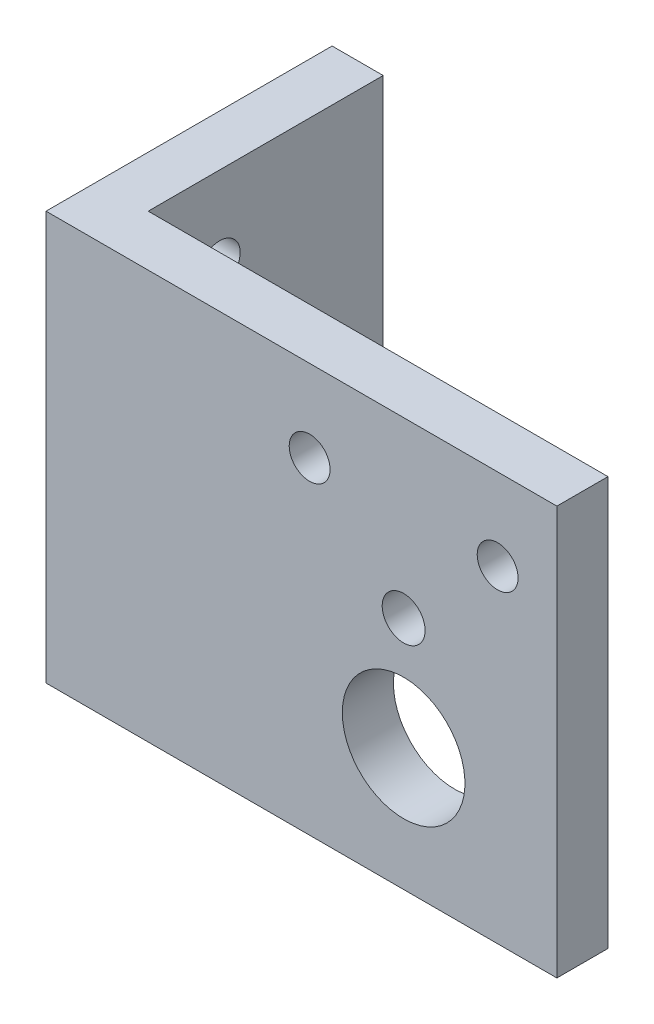
ISO-10303-21;
HEADER;
FILE_DESCRIPTION(('STEP AP214'),'2;1');
FILE_NAME('part.step','',(''),(''),'','','');
FILE_SCHEMA(('AUTOMOTIVE_DESIGN { 1 0 10303 214 1 1 1 1 }'));
ENDSEC;
DATA;
#1=APPLICATION_CONTEXT('core data for automotive mechanical design processes');
#2=APPLICATION_PROTOCOL_DEFINITION('international standard','automotive_design',2000,#1);
#3=PRODUCT_CONTEXT('',#1,'mechanical');
#4=PRODUCT('Part','Part','',(#3));
#5=PRODUCT_RELATED_PRODUCT_CATEGORY('part','',(#4));
#6=PRODUCT_DEFINITION_FORMATION('','',#4);
#7=PRODUCT_DEFINITION_CONTEXT('part definition',#1,'design');
#8=PRODUCT_DEFINITION('design','',#6,#7);
#9=PRODUCT_DEFINITION_SHAPE('','',#8);
#10=(LENGTH_UNIT() NAMED_UNIT(*) SI_UNIT(.MILLI.,.METRE.));
#11=(NAMED_UNIT(*) PLANE_ANGLE_UNIT() SI_UNIT($,.RADIAN.));
#12=(NAMED_UNIT(*) SI_UNIT($,.STERADIAN.) SOLID_ANGLE_UNIT());
#13=UNCERTAINTY_MEASURE_WITH_UNIT(LENGTH_MEASURE(1.E-05),#10,'distance_accuracy_value','');
#14=(GEOMETRIC_REPRESENTATION_CONTEXT(3) GLOBAL_UNCERTAINTY_ASSIGNED_CONTEXT((#13)) GLOBAL_UNIT_ASSIGNED_CONTEXT((#10,
#11,#12)) REPRESENTATION_CONTEXT('',''));
#15=CARTESIAN_POINT('',(0.,0.,0.));
#16=DIRECTION('',(0.,0.,1.));
#17=DIRECTION('',(1.,0.,0.));
#18=AXIS2_PLACEMENT_3D('',#15,#16,#17);
#19=CARTESIAN_POINT('',(5.,20.,-20.));
#20=DIRECTION('',(-0.707106781186548,0.,0.707106781186548));
#21=DIRECTION('',(0.707106781186547,0.,0.707106781186547));
#22=AXIS2_PLACEMENT_3D('',#19,#20,#21);
#23=PLANE('',#22);
#24=DIRECTION('',(0.,1.,0.));
#25=VECTOR('',#24,1.);
#26=CARTESIAN_POINT('',(5.,40.,-20.));
#27=LINE('',#26,#25);
#28=CARTESIAN_POINT('',(5.,16.75,-20.));
#29=VERTEX_POINT('',#28);
#30=CARTESIAN_POINT('',(5.,15.,-20.));
#31=VERTEX_POINT('',#30);
#32=EDGE_CURVE('E120',#29,#31,#27,.F.);
#33=ORIENTED_EDGE('',*,*,#32,.F.);
#34=CARTESIAN_POINT('',(5.,20.,-20.));
#35=DIRECTION('',(-0.707106781186548,0.,0.707106781186548));
#36=DIRECTION('',(-0.707106781186548,0.,-0.707106781186548));
#37=AXIS2_PLACEMENT_3D('',#34,#35,#36);
#38=ELLIPSE('',#37,4.59619407771255,3.25);
#39=CARTESIAN_POINT('',(5.,23.25,-20.));
#40=VERTEX_POINT('',#39);
#41=EDGE_CURVE('E11',#29,#40,#38,.T.);
#42=ORIENTED_EDGE('',*,*,#41,.T.);
#43=CARTESIAN_POINT('',(5.,25.,-20.));
#44=VERTEX_POINT('',#43);
#45=EDGE_CURVE('E117',#44,#40,#27,.F.);
#46=ORIENTED_EDGE('',*,*,#45,.F.);
#47=DIRECTION('',(0.707106781186547,0.,0.707106781186547));
#48=VECTOR('',#47,1.);
#49=CARTESIAN_POINT('',(5.,25.,-20.));
#50=LINE('',#49,#48);
#51=CARTESIAN_POINT('',(20.,25.,-5.));
#52=VERTEX_POINT('',#51);
#53=EDGE_CURVE('E208',#44,#52,#50,.T.);
#54=ORIENTED_EDGE('',*,*,#53,.T.);
#55=DIRECTION('',(0.,-1.,0.));
#56=VECTOR('',#55,1.);
#57=CARTESIAN_POINT('',(20.,40.,-5.));
#58=LINE('',#57,#56);
#59=CARTESIAN_POINT('',(20.,15.,-5.));
#60=VERTEX_POINT('',#59);
#61=EDGE_CURVE('E199',#60,#52,#58,.F.);
#62=ORIENTED_EDGE('',*,*,#61,.F.);
#63=DIRECTION('',(0.707106781186547,0.,0.707106781186547));
#64=VECTOR('',#63,1.);
#65=CARTESIAN_POINT('',(5.,15.,-20.));
#66=LINE('',#65,#64);
#67=EDGE_CURVE('E209',#31,#60,#66,.T.);
#68=ORIENTED_EDGE('',*,*,#67,.F.);
#69=EDGE_LOOP('',(#33,#42,#46,#54,#62,#68));
#70=FACE_BOUND('',#69,.T.);
#71=ADVANCED_FACE('F35',(#70),#23,.F.);
#72=CARTESIAN_POINT('',(0.,40.,-35.));
#73=DIRECTION('',(1.,0.,0.));
#74=DIRECTION('',(0.,0.,-1.));
#75=AXIS2_PLACEMENT_3D('',#72,#73,#74);
#76=PLANE('',#75);
#77=CARTESIAN_POINT('',(0.,20.,-20.));
#78=DIRECTION('',(1.,0.,0.));
#79=DIRECTION('',(0.,0.,-1.));
#80=AXIS2_PLACEMENT_3D('',#77,#78,#79);
#81=CIRCLE('',#80,2.);
#82=CARTESIAN_POINT('',(0.,20.,-22.));
#83=VERTEX_POINT('',#82);
#84=EDGE_CURVE('E112',#83,#83,#81,.T.);
#85=ORIENTED_EDGE('',*,*,#84,.T.);
#86=EDGE_LOOP('',(#85));
#87=FACE_BOUND('',#86,.T.);
#88=DIRECTION('',(0.,0.,1.));
#89=VECTOR('',#88,1.);
#90=CARTESIAN_POINT('',(0.,40.,-35.));
#91=LINE('',#90,#89);
#92=CARTESIAN_POINT('',(0.,40.,-28.));
#93=VERTEX_POINT('',#92);
#94=CARTESIAN_POINT('',(0.,40.,0.));
#95=VERTEX_POINT('',#94);
#96=EDGE_CURVE('E145',#93,#95,#91,.T.);
#97=ORIENTED_EDGE('',*,*,#96,.F.);
#98=DIRECTION('',(0.,-1.,0.));
#99=VECTOR('',#98,1.);
#100=CARTESIAN_POINT('',(0.,40.,-28.));
#101=LINE('',#100,#99);
#102=CARTESIAN_POINT('',(0.,0.,-28.));
#103=VERTEX_POINT('',#102);
#104=EDGE_CURVE('E216',#93,#103,#101,.T.);
#105=ORIENTED_EDGE('',*,*,#104,.T.);
#106=DIRECTION('',(0.,0.,1.));
#107=VECTOR('',#106,1.);
#108=CARTESIAN_POINT('',(0.,0.,-35.));
#109=LINE('',#108,#107);
#110=CARTESIAN_POINT('',(0.,0.,0.));
#111=VERTEX_POINT('',#110);
#112=EDGE_CURVE('E153',#103,#111,#109,.T.);
#113=ORIENTED_EDGE('',*,*,#112,.T.);
#114=DIRECTION('',(0.,-1.,0.));
#115=VECTOR('',#114,1.);
#116=CARTESIAN_POINT('',(0.,40.,0.));
#117=LINE('',#116,#115);
#118=EDGE_CURVE('E130',#95,#111,#117,.T.);
#119=ORIENTED_EDGE('',*,*,#118,.F.);
#120=EDGE_LOOP('',(#97,#105,#113,#119));
#121=FACE_BOUND('',#120,.T.);
#122=CARTESIAN_POINT('',(0.,32.,-12.));
#123=DIRECTION('',(1.,0.,0.));
#124=DIRECTION('',(0.,0.,-1.));
#125=AXIS2_PLACEMENT_3D('',#122,#123,#124);
#126=CIRCLE('',#125,2.);
#127=CARTESIAN_POINT('',(0.,32.,-14.));
#128=VERTEX_POINT('',#127);
#129=EDGE_CURVE('E170',#128,#128,#126,.T.);
#130=ORIENTED_EDGE('',*,*,#129,.T.);
#131=EDGE_LOOP('',(#130));
#132=FACE_BOUND('',#131,.T.);
#133=CARTESIAN_POINT('',(0.,8.,-12.));
#134=DIRECTION('',(1.,0.,0.));
#135=DIRECTION('',(0.,0.,-1.));
#136=AXIS2_PLACEMENT_3D('',#133,#134,#135);
#137=CIRCLE('',#136,2.);
#138=CARTESIAN_POINT('',(0.,8.,-14.));
#139=VERTEX_POINT('',#138);
#140=EDGE_CURVE('E192',#139,#139,#137,.T.);
#141=ORIENTED_EDGE('',*,*,#140,.T.);
#142=EDGE_LOOP('',(#141));
#143=FACE_BOUND('',#142,.T.);
#144=ADVANCED_FACE('F37',(#87,#121,#132,#143),#76,.F.);
#145=CARTESIAN_POINT('',(0.,40.,0.));
#146=DIRECTION('',(0.,0.,-1.));
#147=DIRECTION('',(-1.,0.,0.));
#148=AXIS2_PLACEMENT_3D('',#145,#146,#147);
#149=PLANE('',#148);
#150=CARTESIAN_POINT('',(35.,12.,0.));
#151=DIRECTION('',(0.,0.,-1.));
#152=DIRECTION('',(-1.,0.,0.));
#153=AXIS2_PLACEMENT_3D('',#150,#151,#152);
#154=CIRCLE('',#153,5.99999999999999);
#155=CARTESIAN_POINT('',(29.,12.,0.));
#156=VERTEX_POINT('',#155);
#157=EDGE_CURVE('E155',#156,#156,#154,.T.);
#158=ORIENTED_EDGE('',*,*,#157,.T.);
#159=EDGE_LOOP('',(#158));
#160=FACE_BOUND('',#159,.T.);
#161=CARTESIAN_POINT('',(35.,23.,0.));
#162=DIRECTION('',(0.,0.,-1.));
#163=DIRECTION('',(-1.,0.,0.));
#164=AXIS2_PLACEMENT_3D('',#161,#162,#163);
#165=CIRCLE('',#164,2.1);
#166=CARTESIAN_POINT('',(32.9,23.,0.));
#167=VERTEX_POINT('',#166);
#168=EDGE_CURVE('E182',#167,#167,#165,.T.);
#169=ORIENTED_EDGE('',*,*,#168,.T.);
#170=EDGE_LOOP('',(#169));
#171=FACE_BOUND('',#170,.T.);
#172=CARTESIAN_POINT('',(44.2,32.,0.));
#173=DIRECTION('',(0.,0.,-1.));
#174=DIRECTION('',(-1.,0.,0.));
#175=AXIS2_PLACEMENT_3D('',#172,#173,#174);
#176=CIRCLE('',#175,2.);
#177=CARTESIAN_POINT('',(42.2,32.,0.));
#178=VERTEX_POINT('',#177);
#179=EDGE_CURVE('E176',#178,#178,#176,.T.);
#180=ORIENTED_EDGE('',*,*,#179,.T.);
#181=EDGE_LOOP('',(#180));
#182=FACE_BOUND('',#181,.T.);
#183=CARTESIAN_POINT('',(25.8,32.,0.));
#184=DIRECTION('',(0.,0.,-1.));
#185=DIRECTION('',(-1.,0.,0.));
#186=AXIS2_PLACEMENT_3D('',#183,#184,#185);
#187=CIRCLE('',#186,2.);
#188=CARTESIAN_POINT('',(23.8,32.,0.));
#189=VERTEX_POINT('',#188);
#190=EDGE_CURVE('E169',#189,#189,#187,.T.);
#191=ORIENTED_EDGE('',*,*,#190,.T.);
#192=EDGE_LOOP('',(#191));
#193=FACE_BOUND('',#192,.T.);
#194=ORIENTED_EDGE('',*,*,#118,.T.);
#195=DIRECTION('',(1.,0.,0.));
#196=VECTOR('',#195,1.);
#197=CARTESIAN_POINT('',(0.,0.,0.));
#198=LINE('',#197,#196);
#199=CARTESIAN_POINT('',(50.,0.,0.));
#200=VERTEX_POINT('',#199);
#201=EDGE_CURVE('E151',#111,#200,#198,.T.);
#202=ORIENTED_EDGE('',*,*,#201,.T.);
#203=DIRECTION('',(0.,-1.,0.));
#204=VECTOR('',#203,1.);
#205=CARTESIAN_POINT('',(50.,40.,0.));
#206=LINE('',#205,#204);
#207=CARTESIAN_POINT('',(50.,40.,0.));
#208=VERTEX_POINT('',#207);
#209=EDGE_CURVE('E133',#208,#200,#206,.T.);
#210=ORIENTED_EDGE('',*,*,#209,.F.);
#211=DIRECTION('',(1.,0.,0.));
#212=VECTOR('',#211,1.);
#213=CARTESIAN_POINT('',(0.,40.,0.));
#214=LINE('',#213,#212);
#215=EDGE_CURVE('E163',#95,#208,#214,.T.);
#216=ORIENTED_EDGE('',*,*,#215,.F.);
#217=EDGE_LOOP('',(#194,#202,#210,#216));
#218=FACE_BOUND('',#217,.T.);
#219=ADVANCED_FACE('F255',(#160,#171,#182,#193,#218),#149,.F.);
#220=CARTESIAN_POINT('',(50.,40.,0.));
#221=DIRECTION('',(-1.,0.,0.));
#222=DIRECTION('',(0.,0.,1.));
#223=AXIS2_PLACEMENT_3D('',#220,#221,#222);
#224=PLANE('',#223);
#225=DIRECTION('',(0.,0.,-1.));
#226=VECTOR('',#225,1.);
#227=CARTESIAN_POINT('',(50.,0.,0.));
#228=LINE('',#227,#226);
#229=CARTESIAN_POINT('',(50.,0.,-5.));
#230=VERTEX_POINT('',#229);
#231=EDGE_CURVE('E149',#200,#230,#228,.T.);
#232=ORIENTED_EDGE('',*,*,#231,.T.);
#233=DIRECTION('',(0.,-1.,0.));
#234=VECTOR('',#233,1.);
#235=CARTESIAN_POINT('',(50.,40.,-5.));
#236=LINE('',#235,#234);
#237=CARTESIAN_POINT('',(50.,40.,-5.));
#238=VERTEX_POINT('',#237);
#239=EDGE_CURVE('E136',#238,#230,#236,.T.);
#240=ORIENTED_EDGE('',*,*,#239,.F.);
#241=DIRECTION('',(0.,0.,-1.));
#242=VECTOR('',#241,1.);
#243=CARTESIAN_POINT('',(50.,40.,0.));
#244=LINE('',#243,#242);
#245=EDGE_CURVE('E161',#208,#238,#244,.T.);
#246=ORIENTED_EDGE('',*,*,#245,.F.);
#247=ORIENTED_EDGE('',*,*,#209,.T.);
#248=EDGE_LOOP('',(#232,#240,#246,#247));
#249=FACE_BOUND('',#248,.T.);
#250=ADVANCED_FACE('F246',(#249),#224,.F.);
#251=CARTESIAN_POINT('',(50.,40.,-5.));
#252=DIRECTION('',(0.,0.,1.));
#253=DIRECTION('',(1.,0.,0.));
#254=AXIS2_PLACEMENT_3D('',#251,#252,#253);
#255=PLANE('',#254);
#256=CARTESIAN_POINT('',(35.,12.,-5.));
#257=DIRECTION('',(0.,0.,-1.));
#258=DIRECTION('',(-1.,0.,0.));
#259=AXIS2_PLACEMENT_3D('',#256,#257,#258);
#260=CIRCLE('',#259,5.99999999999999);
#261=CARTESIAN_POINT('',(29.,12.,-5.));
#262=VERTEX_POINT('',#261);
#263=EDGE_CURVE('E185',#262,#262,#260,.T.);
#264=ORIENTED_EDGE('',*,*,#263,.F.);
#265=EDGE_LOOP('',(#264));
#266=FACE_BOUND('',#265,.T.);
#267=CARTESIAN_POINT('',(35.,23.,-5.));
#268=DIRECTION('',(0.,0.,-1.));
#269=DIRECTION('',(-1.,0.,0.));
#270=AXIS2_PLACEMENT_3D('',#267,#268,#269);
#271=CIRCLE('',#270,2.1);
#272=CARTESIAN_POINT('',(32.9,23.,-5.));
#273=VERTEX_POINT('',#272);
#274=EDGE_CURVE('E179',#273,#273,#271,.T.);
#275=ORIENTED_EDGE('',*,*,#274,.F.);
#276=EDGE_LOOP('',(#275));
#277=FACE_BOUND('',#276,.T.);
#278=CARTESIAN_POINT('',(44.2,32.,-5.));
#279=DIRECTION('',(0.,0.,-1.));
#280=DIRECTION('',(-1.,0.,0.));
#281=AXIS2_PLACEMENT_3D('',#278,#279,#280);
#282=CIRCLE('',#281,2.);
#283=CARTESIAN_POINT('',(42.2,32.,-5.));
#284=VERTEX_POINT('',#283);
#285=EDGE_CURVE('E173',#284,#284,#282,.T.);
#286=ORIENTED_EDGE('',*,*,#285,.F.);
#287=EDGE_LOOP('',(#286));
#288=FACE_BOUND('',#287,.T.);
#289=CARTESIAN_POINT('',(25.8,32.,-5.));
#290=DIRECTION('',(0.,0.,-1.));
#291=DIRECTION('',(-1.,0.,0.));
#292=AXIS2_PLACEMENT_3D('',#289,#290,#291);
#293=CIRCLE('',#292,2.);
#294=CARTESIAN_POINT('',(23.8,32.,-5.));
#295=VERTEX_POINT('',#294);
#296=EDGE_CURVE('E166',#295,#295,#293,.T.);
#297=ORIENTED_EDGE('',*,*,#296,.F.);
#298=EDGE_LOOP('',(#297));
#299=FACE_BOUND('',#298,.T.);
#300=ORIENTED_EDGE('',*,*,#61,.T.);
#301=DIRECTION('',(-1.,0.,0.));
#302=VECTOR('',#301,1.);
#303=CARTESIAN_POINT('',(50.,25.,-5.));
#304=LINE('',#303,#302);
#305=CARTESIAN_POINT('',(5.00000000000001,25.,-4.99999999999999));
#306=VERTEX_POINT('',#305);
#307=EDGE_CURVE('E203',#52,#306,#304,.T.);
#308=ORIENTED_EDGE('',*,*,#307,.T.);
#309=DIRECTION('',(0.,-1.,0.));
#310=VECTOR('',#309,1.);
#311=CARTESIAN_POINT('',(5.00000000000001,40.,-4.99999999999999));
#312=LINE('',#311,#310);
#313=CARTESIAN_POINT('',(5.00000000000001,40.,-4.99999999999999));
#314=VERTEX_POINT('',#313);
#315=EDGE_CURVE('E139',#314,#306,#312,.T.);
#316=ORIENTED_EDGE('',*,*,#315,.F.);
#317=DIRECTION('',(-1.,0.,0.));
#318=VECTOR('',#317,1.);
#319=CARTESIAN_POINT('',(50.,40.,-5.));
#320=LINE('',#319,#318);
#321=EDGE_CURVE('E159',#238,#314,#320,.T.);
#322=ORIENTED_EDGE('',*,*,#321,.F.);
#323=ORIENTED_EDGE('',*,*,#239,.T.);
#324=DIRECTION('',(-1.,0.,0.));
#325=VECTOR('',#324,1.);
#326=CARTESIAN_POINT('',(50.,0.,-5.));
#327=LINE('',#326,#325);
#328=CARTESIAN_POINT('',(5.00000000000001,0.,-4.99999999999999));
#329=VERTEX_POINT('',#328);
#330=EDGE_CURVE('E146',#230,#329,#327,.T.);
#331=ORIENTED_EDGE('',*,*,#330,.T.);
#332=CARTESIAN_POINT('',(5.00000000000001,15.,-4.99999999999999));
#333=VERTEX_POINT('',#332);
#334=EDGE_CURVE('E141',#333,#329,#312,.T.);
#335=ORIENTED_EDGE('',*,*,#334,.F.);
#336=DIRECTION('',(-1.,0.,0.));
#337=VECTOR('',#336,1.);
#338=CARTESIAN_POINT('',(50.,15.,-5.));
#339=LINE('',#338,#337);
#340=EDGE_CURVE('E205',#60,#333,#339,.T.);
#341=ORIENTED_EDGE('',*,*,#340,.F.);
#342=EDGE_LOOP('',(#300,#308,#316,#322,#323,#331,#335,#341));
#343=FACE_BOUND('',#342,.T.);
#344=ADVANCED_FACE('F237',(#266,#277,#288,#299,#343),#255,.F.);
#345=CARTESIAN_POINT('',(5.00000000000001,40.,-4.99999999999999));
#346=DIRECTION('',(-1.,0.,0.));
#347=DIRECTION('',(0.,0.,1.));
#348=AXIS2_PLACEMENT_3D('',#345,#346,#347);
#349=PLANE('',#348);
#350=CARTESIAN_POINT('',(5.,20.,-20.));
#351=DIRECTION('',(1.,0.,0.));
#352=DIRECTION('',(0.,0.,-1.));
#353=AXIS2_PLACEMENT_3D('',#350,#351,#352);
#354=CIRCLE('',#353,2.);
#355=CARTESIAN_POINT('',(5.,20.,-22.));
#356=VERTEX_POINT('',#355);
#357=EDGE_CURVE('E221',#356,#356,#354,.T.);
#358=ORIENTED_EDGE('',*,*,#357,.F.);
#359=EDGE_LOOP('',(#358));
#360=FACE_BOUND('',#359,.T.);
#361=ORIENTED_EDGE('',*,*,#45,.T.);
#362=CARTESIAN_POINT('',(5.,20.,-20.));
#363=DIRECTION('',(1.,0.,0.));
#364=DIRECTION('',(0.,0.,-1.));
#365=AXIS2_PLACEMENT_3D('',#362,#363,#364);
#366=CIRCLE('',#365,3.25);
#367=EDGE_CURVE('E50',#40,#29,#366,.T.);
#368=ORIENTED_EDGE('',*,*,#367,.T.);
#369=ORIENTED_EDGE('',*,*,#32,.T.);
#370=DIRECTION('',(0.,0.,-1.));
#371=VECTOR('',#370,1.);
#372=CARTESIAN_POINT('',(5.00000000000001,15.,-4.99999999999999));
#373=LINE('',#372,#371);
#374=EDGE_CURVE('E126',#333,#31,#373,.T.);
#375=ORIENTED_EDGE('',*,*,#374,.F.);
#376=ORIENTED_EDGE('',*,*,#334,.T.);
#377=DIRECTION('',(0.,0.,-1.));
#378=VECTOR('',#377,1.);
#379=CARTESIAN_POINT('',(5.00000000000001,0.,-4.99999999999999));
#380=LINE('',#379,#378);
#381=CARTESIAN_POINT('',(5.,0.,-28.));
#382=VERTEX_POINT('',#381);
#383=EDGE_CURVE('E142',#329,#382,#380,.T.);
#384=ORIENTED_EDGE('',*,*,#383,.T.);
#385=DIRECTION('',(0.,-1.,0.));
#386=VECTOR('',#385,1.);
#387=CARTESIAN_POINT('',(5.,40.,-28.));
#388=LINE('',#387,#386);
#389=CARTESIAN_POINT('',(5.,40.,-28.));
#390=VERTEX_POINT('',#389);
#391=EDGE_CURVE('E58',#390,#382,#388,.T.);
#392=ORIENTED_EDGE('',*,*,#391,.F.);
#393=DIRECTION('',(0.,0.,-1.));
#394=VECTOR('',#393,1.);
#395=CARTESIAN_POINT('',(5.00000000000001,40.,-4.99999999999999));
#396=LINE('',#395,#394);
#397=EDGE_CURVE('E156',#314,#390,#396,.T.);
#398=ORIENTED_EDGE('',*,*,#397,.F.);
#399=ORIENTED_EDGE('',*,*,#315,.T.);
#400=DIRECTION('',(0.,0.,-1.));
#401=VECTOR('',#400,1.);
#402=CARTESIAN_POINT('',(5.00000000000001,25.,-4.99999999999999));
#403=LINE('',#402,#401);
#404=EDGE_CURVE('E43',#306,#44,#403,.T.);
#405=ORIENTED_EDGE('',*,*,#404,.T.);
#406=EDGE_LOOP('',(#361,#368,#369,#375,#376,#384,#392,#398,#399,#405));
#407=FACE_BOUND('',#406,.T.);
#408=CARTESIAN_POINT('',(5.,32.,-12.));
#409=DIRECTION('',(1.,0.,0.));
#410=DIRECTION('',(0.,0.,-1.));
#411=AXIS2_PLACEMENT_3D('',#408,#409,#410);
#412=CIRCLE('',#411,2.);
#413=CARTESIAN_POINT('',(5.,32.,-14.));
#414=VERTEX_POINT('',#413);
#415=EDGE_CURVE('E195',#414,#414,#412,.T.);
#416=ORIENTED_EDGE('',*,*,#415,.F.);
#417=EDGE_LOOP('',(#416));
#418=FACE_BOUND('',#417,.T.);
#419=CARTESIAN_POINT('',(5.,8.,-12.));
#420=DIRECTION('',(1.,0.,0.));
#421=DIRECTION('',(0.,0.,-1.));
#422=AXIS2_PLACEMENT_3D('',#419,#420,#421);
#423=CIRCLE('',#422,2.);
#424=CARTESIAN_POINT('',(5.,8.,-14.));
#425=VERTEX_POINT('',#424);
#426=EDGE_CURVE('E196',#425,#425,#423,.T.);
#427=ORIENTED_EDGE('',*,*,#426,.F.);
#428=EDGE_LOOP('',(#427));
#429=FACE_BOUND('',#428,.T.);
#430=ADVANCED_FACE('F121',(#360,#407,#418,#429),#349,.F.);
#431=CARTESIAN_POINT('',(0.,40.,0.));
#432=DIRECTION('',(0.,1.,0.));
#433=DIRECTION('',(0.,0.,1.));
#434=AXIS2_PLACEMENT_3D('',#431,#432,#433);
#435=PLANE('',#434);
#436=DIRECTION('',(1.,0.,0.));
#437=VECTOR('',#436,1.);
#438=CARTESIAN_POINT('',(0.,40.,-28.));
#439=LINE('',#438,#437);
#440=EDGE_CURVE('E214',#93,#390,#439,.T.);
#441=ORIENTED_EDGE('',*,*,#440,.F.);
#442=ORIENTED_EDGE('',*,*,#96,.T.);
#443=ORIENTED_EDGE('',*,*,#215,.T.);
#444=ORIENTED_EDGE('',*,*,#245,.T.);
#445=ORIENTED_EDGE('',*,*,#321,.T.);
#446=ORIENTED_EDGE('',*,*,#397,.T.);
#447=EDGE_LOOP('',(#441,#442,#443,#444,#445,#446));
#448=FACE_BOUND('',#447,.T.);
#449=ADVANCED_FACE('F236',(#448),#435,.T.);
#450=CARTESIAN_POINT('',(0.,0.,0.));
#451=DIRECTION('',(0.,1.,0.));
#452=DIRECTION('',(0.,0.,1.));
#453=AXIS2_PLACEMENT_3D('',#450,#451,#452);
#454=PLANE('',#453);
#455=ORIENTED_EDGE('',*,*,#112,.F.);
#456=DIRECTION('',(1.,0.,0.));
#457=VECTOR('',#456,1.);
#458=CARTESIAN_POINT('',(0.,0.,-28.));
#459=LINE('',#458,#457);
#460=EDGE_CURVE('E212',#103,#382,#459,.T.);
#461=ORIENTED_EDGE('',*,*,#460,.T.);
#462=ORIENTED_EDGE('',*,*,#383,.F.);
#463=ORIENTED_EDGE('',*,*,#330,.F.);
#464=ORIENTED_EDGE('',*,*,#231,.F.);
#465=ORIENTED_EDGE('',*,*,#201,.F.);
#466=EDGE_LOOP('',(#455,#461,#462,#463,#464,#465));
#467=FACE_BOUND('',#466,.T.);
#468=ADVANCED_FACE('F243',(#467),#454,.F.);
#469=CARTESIAN_POINT('',(25.8,32.,0.));
#470=DIRECTION('',(0.,0.,-1.));
#471=DIRECTION('',(-1.,0.,0.));
#472=AXIS2_PLACEMENT_3D('',#469,#470,#471);
#473=CYLINDRICAL_SURFACE('',#472,2.);
#474=ORIENTED_EDGE('',*,*,#190,.F.);
#475=EDGE_LOOP('',(#474));
#476=FACE_BOUND('',#475,.T.);
#477=ORIENTED_EDGE('',*,*,#296,.T.);
#478=EDGE_LOOP('',(#477));
#479=FACE_BOUND('',#478,.T.);
#480=ADVANCED_FACE('F280',(#476,#479),#473,.F.);
#481=CARTESIAN_POINT('',(44.2,32.,0.));
#482=DIRECTION('',(0.,0.,-1.));
#483=DIRECTION('',(-1.,0.,0.));
#484=AXIS2_PLACEMENT_3D('',#481,#482,#483);
#485=CYLINDRICAL_SURFACE('',#484,2.);
#486=ORIENTED_EDGE('',*,*,#179,.F.);
#487=EDGE_LOOP('',(#486));
#488=FACE_BOUND('',#487,.T.);
#489=ORIENTED_EDGE('',*,*,#285,.T.);
#490=EDGE_LOOP('',(#489));
#491=FACE_BOUND('',#490,.T.);
#492=ADVANCED_FACE('F276',(#488,#491),#485,.F.);
#493=CARTESIAN_POINT('',(35.,23.,0.));
#494=DIRECTION('',(0.,0.,-1.));
#495=DIRECTION('',(-1.,0.,0.));
#496=AXIS2_PLACEMENT_3D('',#493,#494,#495);
#497=CYLINDRICAL_SURFACE('',#496,2.1);
#498=ORIENTED_EDGE('',*,*,#168,.F.);
#499=EDGE_LOOP('',(#498));
#500=FACE_BOUND('',#499,.T.);
#501=ORIENTED_EDGE('',*,*,#274,.T.);
#502=EDGE_LOOP('',(#501));
#503=FACE_BOUND('',#502,.T.);
#504=ADVANCED_FACE('F272',(#500,#503),#497,.F.);
#505=CARTESIAN_POINT('',(35.,12.,0.));
#506=DIRECTION('',(0.,0.,-1.));
#507=DIRECTION('',(-1.,0.,0.));
#508=AXIS2_PLACEMENT_3D('',#505,#506,#507);
#509=CYLINDRICAL_SURFACE('',#508,5.99999999999999);
#510=ORIENTED_EDGE('',*,*,#157,.F.);
#511=EDGE_LOOP('',(#510));
#512=FACE_BOUND('',#511,.T.);
#513=ORIENTED_EDGE('',*,*,#263,.T.);
#514=EDGE_LOOP('',(#513));
#515=FACE_BOUND('',#514,.T.);
#516=ADVANCED_FACE('F268',(#512,#515),#509,.F.);
#517=CARTESIAN_POINT('',(-5.,8.,-12.));
#518=DIRECTION('',(1.,0.,0.));
#519=DIRECTION('',(0.,0.,-1.));
#520=AXIS2_PLACEMENT_3D('',#517,#518,#519);
#521=CYLINDRICAL_SURFACE('',#520,2.);
#522=ORIENTED_EDGE('',*,*,#426,.T.);
#523=EDGE_LOOP('',(#522));
#524=FACE_BOUND('',#523,.T.);
#525=ORIENTED_EDGE('',*,*,#140,.F.);
#526=EDGE_LOOP('',(#525));
#527=FACE_BOUND('',#526,.T.);
#528=ADVANCED_FACE('F264',(#524,#527),#521,.F.);
#529=CARTESIAN_POINT('',(-5.,32.,-12.));
#530=DIRECTION('',(1.,0.,0.));
#531=DIRECTION('',(0.,0.,-1.));
#532=AXIS2_PLACEMENT_3D('',#529,#530,#531);
#533=CYLINDRICAL_SURFACE('',#532,2.);
#534=ORIENTED_EDGE('',*,*,#415,.T.);
#535=EDGE_LOOP('',(#534));
#536=FACE_BOUND('',#535,.T.);
#537=ORIENTED_EDGE('',*,*,#129,.F.);
#538=EDGE_LOOP('',(#537));
#539=FACE_BOUND('',#538,.T.);
#540=ADVANCED_FACE('F260',(#536,#539),#533,.F.);
#541=CARTESIAN_POINT('',(25.,25.,-17.5));
#542=DIRECTION('',(0.,1.,0.));
#543=DIRECTION('',(0.,0.,1.));
#544=AXIS2_PLACEMENT_3D('',#541,#542,#543);
#545=PLANE('',#544);
#546=ORIENTED_EDGE('',*,*,#307,.F.);
#547=ORIENTED_EDGE('',*,*,#53,.F.);
#548=ORIENTED_EDGE('',*,*,#404,.F.);
#549=EDGE_LOOP('',(#546,#547,#548));
#550=FACE_BOUND('',#549,.T.);
#551=ADVANCED_FACE('F263',(#550),#545,.T.);
#552=CARTESIAN_POINT('',(25.,15.,-17.5));
#553=DIRECTION('',(0.,1.,0.));
#554=DIRECTION('',(0.,0.,1.));
#555=AXIS2_PLACEMENT_3D('',#552,#553,#554);
#556=PLANE('',#555);
#557=ORIENTED_EDGE('',*,*,#67,.T.);
#558=ORIENTED_EDGE('',*,*,#340,.T.);
#559=ORIENTED_EDGE('',*,*,#374,.T.);
#560=EDGE_LOOP('',(#557,#558,#559));
#561=FACE_BOUND('',#560,.T.);
#562=ADVANCED_FACE('F258',(#561),#556,.F.);
#563=CARTESIAN_POINT('',(0.,40.,-28.));
#564=DIRECTION('',(0.,0.,1.));
#565=DIRECTION('',(1.,0.,0.));
#566=AXIS2_PLACEMENT_3D('',#563,#564,#565);
#567=PLANE('',#566);
#568=ORIENTED_EDGE('',*,*,#391,.T.);
#569=ORIENTED_EDGE('',*,*,#460,.F.);
#570=ORIENTED_EDGE('',*,*,#104,.F.);
#571=ORIENTED_EDGE('',*,*,#440,.T.);
#572=EDGE_LOOP('',(#568,#569,#570,#571));
#573=FACE_BOUND('',#572,.T.);
#574=ADVANCED_FACE('F302',(#573),#567,.F.);
#575=CARTESIAN_POINT('',(50.,20.,-20.));
#576=DIRECTION('',(-1.,0.,0.));
#577=DIRECTION('',(0.,0.,1.));
#578=AXIS2_PLACEMENT_3D('',#575,#576,#577);
#579=CYLINDRICAL_SURFACE('',#578,3.25);
#580=ORIENTED_EDGE('',*,*,#367,.F.);
#581=ORIENTED_EDGE('',*,*,#41,.F.);
#582=EDGE_LOOP('',(#580,#581));
#583=FACE_BOUND('',#582,.T.);
#584=ADVANCED_FACE('F110',(#583),#579,.F.);
#585=CARTESIAN_POINT('',(0.,20.,-20.));
#586=DIRECTION('',(1.,0.,0.));
#587=DIRECTION('',(0.,0.,-1.));
#588=AXIS2_PLACEMENT_3D('',#585,#586,#587);
#589=CYLINDRICAL_SURFACE('',#588,2.);
#590=ORIENTED_EDGE('',*,*,#84,.F.);
#591=EDGE_LOOP('',(#590));
#592=FACE_BOUND('',#591,.T.);
#593=ORIENTED_EDGE('',*,*,#357,.T.);
#594=EDGE_LOOP('',(#593));
#595=FACE_BOUND('',#594,.T.);
#596=ADVANCED_FACE('F229',(#592,#595),#589,.F.);
#597=CLOSED_SHELL('',(#71,#144,#219,#250,#344,#430,#449,#468,#480,#492,#504,#516,#528,#540,#551,
#562,#574,#584,#596));
#598=MANIFOLD_SOLID_BREP('B2',#597);
#599=ADVANCED_BREP_SHAPE_REPRESENTATION('',(#18,#598),#14);
#600=SHAPE_DEFINITION_REPRESENTATION(#9,#599);
ENDSEC;
END-ISO-10303-21;
